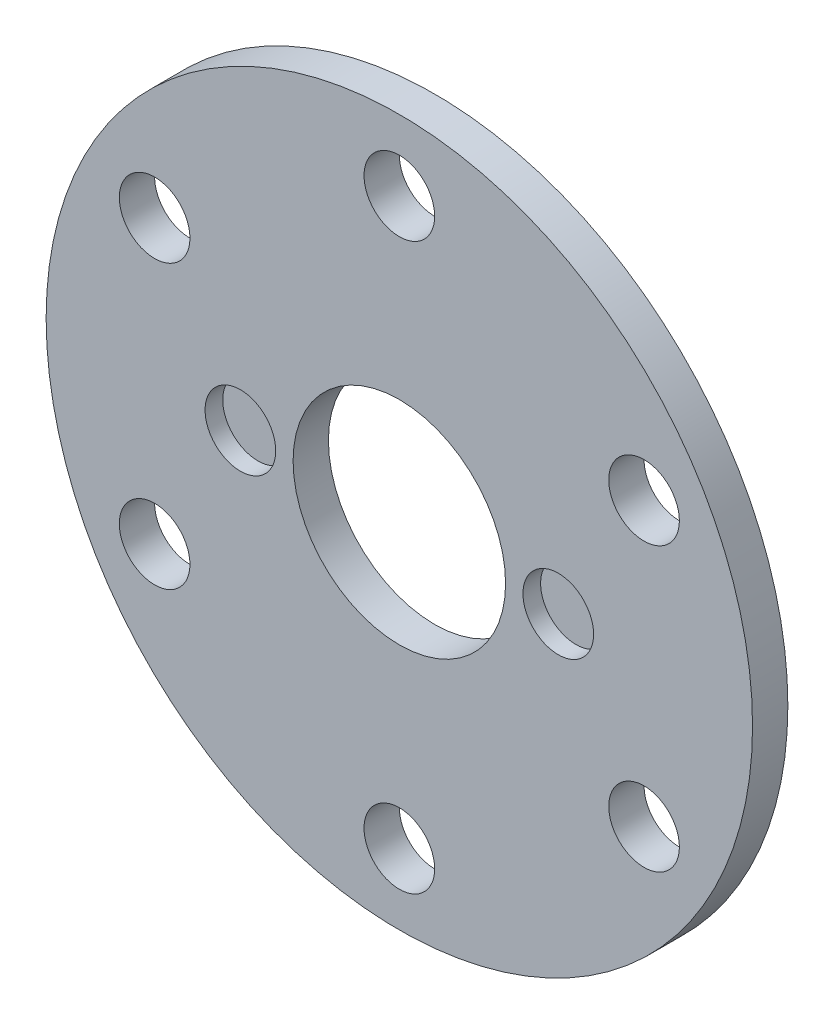
ISO-10303-21;
HEADER;
FILE_DESCRIPTION(('STEP AP214'),'2;1');
FILE_NAME('part.step','',(''),(''),'','','');
FILE_SCHEMA(('AUTOMOTIVE_DESIGN { 1 0 10303 214 1 1 1 1 }'));
ENDSEC;
DATA;
#1=APPLICATION_CONTEXT('core data for automotive mechanical design processes');
#2=APPLICATION_PROTOCOL_DEFINITION('international standard','automotive_design',2000,#1);
#3=PRODUCT_CONTEXT('',#1,'mechanical');
#4=PRODUCT('Part','Part','',(#3));
#5=PRODUCT_RELATED_PRODUCT_CATEGORY('part','',(#4));
#6=PRODUCT_DEFINITION_FORMATION('','',#4);
#7=PRODUCT_DEFINITION_CONTEXT('part definition',#1,'design');
#8=PRODUCT_DEFINITION('design','',#6,#7);
#9=PRODUCT_DEFINITION_SHAPE('','',#8);
#10=(LENGTH_UNIT() NAMED_UNIT(*) SI_UNIT(.MILLI.,.METRE.));
#11=(NAMED_UNIT(*) PLANE_ANGLE_UNIT() SI_UNIT($,.RADIAN.));
#12=(NAMED_UNIT(*) SI_UNIT($,.STERADIAN.) SOLID_ANGLE_UNIT());
#13=UNCERTAINTY_MEASURE_WITH_UNIT(LENGTH_MEASURE(1.E-05),#10,'distance_accuracy_value','');
#14=(GEOMETRIC_REPRESENTATION_CONTEXT(3) GLOBAL_UNCERTAINTY_ASSIGNED_CONTEXT((#13)) GLOBAL_UNIT_ASSIGNED_CONTEXT((#10,
#11,#12)) REPRESENTATION_CONTEXT('',''));
#15=CARTESIAN_POINT('',(0.,0.,0.));
#16=DIRECTION('',(0.,0.,1.));
#17=DIRECTION('',(1.,0.,0.));
#18=AXIS2_PLACEMENT_3D('',#15,#16,#17);
#19=CARTESIAN_POINT('',(0.,762.756140975888,194.376675));
#20=DIRECTION('',(0.,0.,-1.));
#21=DIRECTION('',(-1.,0.,0.));
#22=AXIS2_PLACEMENT_3D('',#19,#20,#21);
#23=CYLINDRICAL_SURFACE('',#22,31.7499999999999);
#24=CARTESIAN_POINT('',(0.,762.756140975888,194.376675));
#25=DIRECTION('',(0.,0.,1.));
#26=DIRECTION('',(1.,0.,0.));
#27=AXIS2_PLACEMENT_3D('',#24,#25,#26);
#28=CIRCLE('',#27,31.7499999999999);
#29=CARTESIAN_POINT('',(31.7499999999999,762.756140975888,194.376675));
#30=VERTEX_POINT('',#29);
#31=EDGE_CURVE('E40',#30,#30,#28,.T.);
#32=ORIENTED_EDGE('',*,*,#31,.F.);
#33=EDGE_LOOP('',(#32));
#34=FACE_BOUND('',#33,.T.);
#35=CARTESIAN_POINT('',(0.,762.756140975888,191.201675));
#36=DIRECTION('',(0.,0.,1.));
#37=DIRECTION('',(1.,0.,0.));
#38=AXIS2_PLACEMENT_3D('',#35,#36,#37);
#39=CIRCLE('',#38,31.7499999999999);
#40=CARTESIAN_POINT('',(31.7499999999999,762.756140975888,191.201675));
#41=VERTEX_POINT('',#40);
#42=EDGE_CURVE('E67',#41,#41,#39,.T.);
#43=ORIENTED_EDGE('',*,*,#42,.T.);
#44=EDGE_LOOP('',(#43));
#45=FACE_BOUND('',#44,.T.);
#46=ADVANCED_FACE('F32',(#34,#45),#23,.T.);
#47=CARTESIAN_POINT('',(0.,788.156140975888,194.376675));
#48=DIRECTION('',(0.,0.,-1.));
#49=DIRECTION('',(-1.,0.,0.));
#50=AXIS2_PLACEMENT_3D('',#47,#48,#49);
#51=CYLINDRICAL_SURFACE('',#50,3.17499999999999);
#52=CARTESIAN_POINT('',(0.,788.156140975888,194.376675));
#53=DIRECTION('',(0.,0.,1.));
#54=DIRECTION('',(1.,0.,0.));
#55=AXIS2_PLACEMENT_3D('',#52,#53,#54);
#56=CIRCLE('',#55,3.17499999999999);
#57=CARTESIAN_POINT('',(3.17499999999999,788.156140975888,194.376675));
#58=VERTEX_POINT('',#57);
#59=EDGE_CURVE('E45',#58,#58,#56,.T.);
#60=ORIENTED_EDGE('',*,*,#59,.T.);
#61=EDGE_LOOP('',(#60));
#62=FACE_BOUND('',#61,.T.);
#63=CARTESIAN_POINT('',(0.,788.156140975888,191.201675));
#64=DIRECTION('',(0.,0.,1.));
#65=DIRECTION('',(1.,0.,0.));
#66=AXIS2_PLACEMENT_3D('',#63,#64,#65);
#67=CIRCLE('',#66,3.17499999999999);
#68=CARTESIAN_POINT('',(3.17499999999999,788.156140975888,191.201675));
#69=VERTEX_POINT('',#68);
#70=EDGE_CURVE('E65',#69,#69,#67,.T.);
#71=ORIENTED_EDGE('',*,*,#70,.F.);
#72=EDGE_LOOP('',(#71));
#73=FACE_BOUND('',#72,.T.);
#74=ADVANCED_FACE('F97',(#62,#73),#51,.F.);
#75=CARTESIAN_POINT('',(21.9970452561247,775.456140975888,194.376675));
#76=DIRECTION('',(0.,0.,-1.));
#77=DIRECTION('',(-1.,0.,0.));
#78=AXIS2_PLACEMENT_3D('',#75,#76,#77);
#79=CYLINDRICAL_SURFACE('',#78,3.17499999999996);
#80=CARTESIAN_POINT('',(21.9970452561247,775.456140975888,194.376675));
#81=DIRECTION('',(0.,0.,1.));
#82=DIRECTION('',(1.,0.,0.));
#83=AXIS2_PLACEMENT_3D('',#80,#81,#82);
#84=CIRCLE('',#83,3.17499999999996);
#85=CARTESIAN_POINT('',(25.1720452561246,775.456140975888,194.376675));
#86=VERTEX_POINT('',#85);
#87=EDGE_CURVE('E92',#86,#86,#84,.T.);
#88=ORIENTED_EDGE('',*,*,#87,.T.);
#89=EDGE_LOOP('',(#88));
#90=FACE_BOUND('',#89,.T.);
#91=CARTESIAN_POINT('',(21.9970452561247,775.456140975888,191.201675));
#92=DIRECTION('',(0.,0.,1.));
#93=DIRECTION('',(1.,0.,0.));
#94=AXIS2_PLACEMENT_3D('',#91,#92,#93);
#95=CIRCLE('',#94,3.17499999999996);
#96=CARTESIAN_POINT('',(25.1720452561246,775.456140975888,191.201675));
#97=VERTEX_POINT('',#96);
#98=EDGE_CURVE('E62',#97,#97,#95,.T.);
#99=ORIENTED_EDGE('',*,*,#98,.F.);
#100=EDGE_LOOP('',(#99));
#101=FACE_BOUND('',#100,.T.);
#102=ADVANCED_FACE('F114',(#90,#101),#79,.F.);
#103=CARTESIAN_POINT('',(21.9970452561247,750.056140975888,194.376675));
#104=DIRECTION('',(0.,0.,-1.));
#105=DIRECTION('',(-1.,0.,0.));
#106=AXIS2_PLACEMENT_3D('',#103,#104,#105);
#107=CYLINDRICAL_SURFACE('',#106,3.17499999999999);
#108=CARTESIAN_POINT('',(21.9970452561247,750.056140975888,194.376675));
#109=DIRECTION('',(0.,0.,1.));
#110=DIRECTION('',(1.,0.,0.));
#111=AXIS2_PLACEMENT_3D('',#108,#109,#110);
#112=CIRCLE('',#111,3.17499999999999);
#113=CARTESIAN_POINT('',(25.1720452561247,750.056140975888,194.376675));
#114=VERTEX_POINT('',#113);
#115=EDGE_CURVE('E89',#114,#114,#112,.T.);
#116=ORIENTED_EDGE('',*,*,#115,.T.);
#117=EDGE_LOOP('',(#116));
#118=FACE_BOUND('',#117,.T.);
#119=CARTESIAN_POINT('',(21.9970452561247,750.056140975888,191.201675));
#120=DIRECTION('',(0.,0.,1.));
#121=DIRECTION('',(1.,0.,0.));
#122=AXIS2_PLACEMENT_3D('',#119,#120,#121);
#123=CIRCLE('',#122,3.17499999999999);
#124=CARTESIAN_POINT('',(25.1720452561247,750.056140975888,191.201675));
#125=VERTEX_POINT('',#124);
#126=EDGE_CURVE('E59',#125,#125,#123,.T.);
#127=ORIENTED_EDGE('',*,*,#126,.F.);
#128=EDGE_LOOP('',(#127));
#129=FACE_BOUND('',#128,.T.);
#130=ADVANCED_FACE('F121',(#118,#129),#107,.F.);
#131=CARTESIAN_POINT('',(0.,737.356140975888,194.376675));
#132=DIRECTION('',(0.,0.,-1.));
#133=DIRECTION('',(-1.,0.,0.));
#134=AXIS2_PLACEMENT_3D('',#131,#132,#133);
#135=CYLINDRICAL_SURFACE('',#134,3.17499999999999);
#136=CARTESIAN_POINT('',(0.,737.356140975888,194.376675));
#137=DIRECTION('',(0.,0.,1.));
#138=DIRECTION('',(1.,0.,0.));
#139=AXIS2_PLACEMENT_3D('',#136,#137,#138);
#140=CIRCLE('',#139,3.17499999999999);
#141=CARTESIAN_POINT('',(3.17500000000005,737.356140975888,194.376675));
#142=VERTEX_POINT('',#141);
#143=EDGE_CURVE('E81',#142,#142,#140,.T.);
#144=ORIENTED_EDGE('',*,*,#143,.T.);
#145=EDGE_LOOP('',(#144));
#146=FACE_BOUND('',#145,.T.);
#147=CARTESIAN_POINT('',(0.,737.356140975888,191.201675));
#148=DIRECTION('',(0.,0.,1.));
#149=DIRECTION('',(1.,0.,0.));
#150=AXIS2_PLACEMENT_3D('',#147,#148,#149);
#151=CIRCLE('',#150,3.17499999999999);
#152=CARTESIAN_POINT('',(3.17500000000005,737.356140975888,191.201675));
#153=VERTEX_POINT('',#152);
#154=EDGE_CURVE('E56',#153,#153,#151,.T.);
#155=ORIENTED_EDGE('',*,*,#154,.F.);
#156=EDGE_LOOP('',(#155));
#157=FACE_BOUND('',#156,.T.);
#158=ADVANCED_FACE('F125',(#146,#157),#135,.F.);
#159=CARTESIAN_POINT('',(-21.9970452561247,750.056140975888,194.376675));
#160=DIRECTION('',(0.,0.,-1.));
#161=DIRECTION('',(-1.,0.,0.));
#162=AXIS2_PLACEMENT_3D('',#159,#160,#161);
#163=CYLINDRICAL_SURFACE('',#162,3.17499999999996);
#164=CARTESIAN_POINT('',(-21.9970452561247,750.056140975888,194.376675));
#165=DIRECTION('',(0.,0.,1.));
#166=DIRECTION('',(1.,0.,0.));
#167=AXIS2_PLACEMENT_3D('',#164,#165,#166);
#168=CIRCLE('',#167,3.17499999999996);
#169=CARTESIAN_POINT('',(-18.8220452561247,750.056140975888,194.376675));
#170=VERTEX_POINT('',#169);
#171=EDGE_CURVE('E76',#170,#170,#168,.T.);
#172=ORIENTED_EDGE('',*,*,#171,.T.);
#173=EDGE_LOOP('',(#172));
#174=FACE_BOUND('',#173,.T.);
#175=CARTESIAN_POINT('',(-21.9970452561247,750.056140975888,191.201675));
#176=DIRECTION('',(0.,0.,1.));
#177=DIRECTION('',(1.,0.,0.));
#178=AXIS2_PLACEMENT_3D('',#175,#176,#177);
#179=CIRCLE('',#178,3.17499999999996);
#180=CARTESIAN_POINT('',(-18.8220452561247,750.056140975888,191.201675));
#181=VERTEX_POINT('',#180);
#182=EDGE_CURVE('E52',#181,#181,#179,.T.);
#183=ORIENTED_EDGE('',*,*,#182,.F.);
#184=EDGE_LOOP('',(#183));
#185=FACE_BOUND('',#184,.T.);
#186=ADVANCED_FACE('F128',(#174,#185),#163,.F.);
#187=CARTESIAN_POINT('',(-21.9970452561247,775.456140975888,194.376675));
#188=DIRECTION('',(0.,0.,-1.));
#189=DIRECTION('',(-1.,0.,0.));
#190=AXIS2_PLACEMENT_3D('',#187,#188,#189);
#191=CYLINDRICAL_SURFACE('',#190,3.17500000000003);
#192=CARTESIAN_POINT('',(-21.9970452561247,775.456140975888,194.376675));
#193=DIRECTION('',(0.,0.,1.));
#194=DIRECTION('',(1.,0.,0.));
#195=AXIS2_PLACEMENT_3D('',#192,#193,#194);
#196=CIRCLE('',#195,3.17500000000003);
#197=CARTESIAN_POINT('',(-18.8220452561246,775.456140975888,194.376675));
#198=VERTEX_POINT('',#197);
#199=EDGE_CURVE('E72',#198,#198,#196,.T.);
#200=ORIENTED_EDGE('',*,*,#199,.T.);
#201=EDGE_LOOP('',(#200));
#202=FACE_BOUND('',#201,.T.);
#203=CARTESIAN_POINT('',(-21.9970452561247,775.456140975888,191.201675));
#204=DIRECTION('',(0.,0.,1.));
#205=DIRECTION('',(1.,0.,0.));
#206=AXIS2_PLACEMENT_3D('',#203,#204,#205);
#207=CIRCLE('',#206,3.17500000000003);
#208=CARTESIAN_POINT('',(-18.8220452561246,775.456140975888,191.201675));
#209=VERTEX_POINT('',#208);
#210=EDGE_CURVE('E49',#209,#209,#207,.T.);
#211=ORIENTED_EDGE('',*,*,#210,.F.);
#212=EDGE_LOOP('',(#211));
#213=FACE_BOUND('',#212,.T.);
#214=ADVANCED_FACE('F34',(#202,#213),#191,.F.);
#215=CARTESIAN_POINT('',(0.,762.756140975888,194.376675));
#216=DIRECTION('',(0.,0.,-1.));
#217=DIRECTION('',(-1.,0.,0.));
#218=AXIS2_PLACEMENT_3D('',#215,#216,#217);
#219=CYLINDRICAL_SURFACE('',#218,9.5504);
#220=CARTESIAN_POINT('',(0.,762.756140975888,194.376675));
#221=DIRECTION('',(0.,0.,1.));
#222=DIRECTION('',(1.,0.,0.));
#223=AXIS2_PLACEMENT_3D('',#220,#221,#222);
#224=CIRCLE('',#223,9.5504);
#225=CARTESIAN_POINT('',(9.55040000000003,762.756140975888,194.376675));
#226=VERTEX_POINT('',#225);
#227=EDGE_CURVE('E10',#226,#226,#224,.F.);
#228=ORIENTED_EDGE('',*,*,#227,.F.);
#229=EDGE_LOOP('',(#228));
#230=FACE_BOUND('',#229,.T.);
#231=CARTESIAN_POINT('',(0.,762.756140975888,191.201675));
#232=DIRECTION('',(0.,0.,1.));
#233=DIRECTION('',(1.,0.,0.));
#234=AXIS2_PLACEMENT_3D('',#231,#232,#233);
#235=CIRCLE('',#234,9.5504);
#236=CARTESIAN_POINT('',(9.55040000000003,762.756140975888,191.201675));
#237=VERTEX_POINT('',#236);
#238=EDGE_CURVE('E36',#237,#237,#235,.F.);
#239=ORIENTED_EDGE('',*,*,#238,.T.);
#240=EDGE_LOOP('',(#239));
#241=FACE_BOUND('',#240,.T.);
#242=ADVANCED_FACE('F104',(#230,#241),#219,.F.);
#243=CARTESIAN_POINT('',(0.,0.,194.376675));
#244=DIRECTION('',(0.,0.,1.));
#245=DIRECTION('',(1.,0.,0.));
#246=AXIS2_PLACEMENT_3D('',#243,#244,#245);
#247=PLANE('',#246);
#248=CARTESIAN_POINT('',(-14.2875,762.756140975888,194.376675));
#249=DIRECTION('',(0.,0.,1.));
#250=DIRECTION('',(1.,0.,0.));
#251=AXIS2_PLACEMENT_3D('',#248,#249,#250);
#252=CIRCLE('',#251,3.17500000000036);
#253=CARTESIAN_POINT('',(-11.1124999999996,762.756140975888,194.376675));
#254=VERTEX_POINT('',#253);
#255=EDGE_CURVE('E176',#254,#254,#252,.T.);
#256=ORIENTED_EDGE('',*,*,#255,.F.);
#257=EDGE_LOOP('',(#256));
#258=FACE_BOUND('',#257,.T.);
#259=CARTESIAN_POINT('',(14.2875,762.756140975888,194.376675));
#260=DIRECTION('',(0.,0.,1.));
#261=DIRECTION('',(1.,0.,0.));
#262=AXIS2_PLACEMENT_3D('',#259,#260,#261);
#263=CIRCLE('',#262,3.17500000000034);
#264=CARTESIAN_POINT('',(17.4625000000004,762.756140975888,194.376675));
#265=VERTEX_POINT('',#264);
#266=EDGE_CURVE('E84',#265,#265,#263,.T.);
#267=ORIENTED_EDGE('',*,*,#266,.F.);
#268=EDGE_LOOP('',(#267));
#269=FACE_BOUND('',#268,.T.);
#270=ORIENTED_EDGE('',*,*,#199,.F.);
#271=EDGE_LOOP('',(#270));
#272=FACE_BOUND('',#271,.T.);
#273=ORIENTED_EDGE('',*,*,#171,.F.);
#274=EDGE_LOOP('',(#273));
#275=FACE_BOUND('',#274,.T.);
#276=ORIENTED_EDGE('',*,*,#143,.F.);
#277=EDGE_LOOP('',(#276));
#278=FACE_BOUND('',#277,.T.);
#279=ORIENTED_EDGE('',*,*,#115,.F.);
#280=EDGE_LOOP('',(#279));
#281=FACE_BOUND('',#280,.T.);
#282=ORIENTED_EDGE('',*,*,#87,.F.);
#283=EDGE_LOOP('',(#282));
#284=FACE_BOUND('',#283,.T.);
#285=ORIENTED_EDGE('',*,*,#59,.F.);
#286=EDGE_LOOP('',(#285));
#287=FACE_BOUND('',#286,.T.);
#288=ORIENTED_EDGE('',*,*,#31,.T.);
#289=EDGE_LOOP('',(#288));
#290=FACE_BOUND('',#289,.T.);
#291=ORIENTED_EDGE('',*,*,#227,.T.);
#292=EDGE_LOOP('',(#291));
#293=FACE_BOUND('',#292,.T.);
#294=ADVANCED_FACE('F100',(#258,#269,#272,#275,#278,#281,#284,#287,#290,#293),#247,.T.);
#295=CARTESIAN_POINT('',(0.,0.,191.201675));
#296=DIRECTION('',(0.,0.,1.));
#297=DIRECTION('',(1.,0.,0.));
#298=AXIS2_PLACEMENT_3D('',#295,#296,#297);
#299=PLANE('',#298);
#300=ORIENTED_EDGE('',*,*,#210,.T.);
#301=EDGE_LOOP('',(#300));
#302=FACE_BOUND('',#301,.T.);
#303=ORIENTED_EDGE('',*,*,#182,.T.);
#304=EDGE_LOOP('',(#303));
#305=FACE_BOUND('',#304,.T.);
#306=ORIENTED_EDGE('',*,*,#154,.T.);
#307=EDGE_LOOP('',(#306));
#308=FACE_BOUND('',#307,.T.);
#309=ORIENTED_EDGE('',*,*,#126,.T.);
#310=EDGE_LOOP('',(#309));
#311=FACE_BOUND('',#310,.T.);
#312=ORIENTED_EDGE('',*,*,#98,.T.);
#313=EDGE_LOOP('',(#312));
#314=FACE_BOUND('',#313,.T.);
#315=ORIENTED_EDGE('',*,*,#70,.T.);
#316=EDGE_LOOP('',(#315));
#317=FACE_BOUND('',#316,.T.);
#318=ORIENTED_EDGE('',*,*,#42,.F.);
#319=EDGE_LOOP('',(#318));
#320=FACE_BOUND('',#319,.T.);
#321=ORIENTED_EDGE('',*,*,#238,.F.);
#322=EDGE_LOOP('',(#321));
#323=FACE_BOUND('',#322,.T.);
#324=ADVANCED_FACE('F103',(#302,#305,#308,#311,#314,#317,#320,#323),#299,.F.);
#325=CARTESIAN_POINT('',(14.2875,762.756140975888,192.789175));
#326=DIRECTION('',(0.,0.,1.));
#327=DIRECTION('',(1.,0.,0.));
#328=AXIS2_PLACEMENT_3D('',#325,#326,#327);
#329=CYLINDRICAL_SURFACE('',#328,3.17500000000034);
#330=CARTESIAN_POINT('',(14.2875,762.756140975888,192.789175));
#331=DIRECTION('',(0.,0.,1.));
#332=DIRECTION('',(1.,0.,0.));
#333=AXIS2_PLACEMENT_3D('',#330,#331,#332);
#334=CIRCLE('',#333,3.17500000000034);
#335=CARTESIAN_POINT('',(17.4625000000004,762.756140975888,192.789175));
#336=VERTEX_POINT('',#335);
#337=EDGE_CURVE('E179',#336,#336,#334,.T.);
#338=ORIENTED_EDGE('',*,*,#337,.F.);
#339=EDGE_LOOP('',(#338));
#340=FACE_BOUND('',#339,.T.);
#341=ORIENTED_EDGE('',*,*,#266,.T.);
#342=EDGE_LOOP('',(#341));
#343=FACE_BOUND('',#342,.T.);
#344=ADVANCED_FACE('F141',(#340,#343),#329,.F.);
#345=CARTESIAN_POINT('',(14.2875,762.756140975888,192.789175));
#346=DIRECTION('',(0.,0.,1.));
#347=DIRECTION('',(1.,0.,0.));
#348=AXIS2_PLACEMENT_3D('',#345,#346,#347);
#349=PLANE('',#348);
#350=ORIENTED_EDGE('',*,*,#337,.T.);
#351=EDGE_LOOP('',(#350));
#352=FACE_BOUND('',#351,.T.);
#353=ADVANCED_FACE('F158',(#352),#349,.T.);
#354=CARTESIAN_POINT('',(-14.2875,762.756140975888,192.789175));
#355=DIRECTION('',(0.,0.,1.));
#356=DIRECTION('',(1.,0.,0.));
#357=AXIS2_PLACEMENT_3D('',#354,#355,#356);
#358=CYLINDRICAL_SURFACE('',#357,3.17500000000036);
#359=CARTESIAN_POINT('',(-14.2875,762.756140975888,192.789175));
#360=DIRECTION('',(0.,0.,1.));
#361=DIRECTION('',(1.,0.,0.));
#362=AXIS2_PLACEMENT_3D('',#359,#360,#361);
#363=CIRCLE('',#362,3.17500000000036);
#364=CARTESIAN_POINT('',(-11.1124999999996,762.756140975888,192.789175));
#365=VERTEX_POINT('',#364);
#366=EDGE_CURVE('E53',#365,#365,#363,.T.);
#367=ORIENTED_EDGE('',*,*,#366,.F.);
#368=EDGE_LOOP('',(#367));
#369=FACE_BOUND('',#368,.T.);
#370=ORIENTED_EDGE('',*,*,#255,.T.);
#371=EDGE_LOOP('',(#370));
#372=FACE_BOUND('',#371,.T.);
#373=ADVANCED_FACE('F164',(#369,#372),#358,.F.);
#374=CARTESIAN_POINT('',(-14.2875,762.756140975888,192.789175));
#375=DIRECTION('',(0.,0.,1.));
#376=DIRECTION('',(1.,0.,0.));
#377=AXIS2_PLACEMENT_3D('',#374,#375,#376);
#378=PLANE('',#377);
#379=ORIENTED_EDGE('',*,*,#366,.T.);
#380=EDGE_LOOP('',(#379));
#381=FACE_BOUND('',#380,.T.);
#382=ADVANCED_FACE('F168',(#381),#378,.T.);
#383=CLOSED_SHELL('',(#46,#74,#102,#130,#158,#186,#214,#242,#294,#324,#344,#353,#373,#382));
#384=MANIFOLD_SOLID_BREP('B2',#383);
#385=ADVANCED_BREP_SHAPE_REPRESENTATION('',(#18,#384),#14);
#386=SHAPE_DEFINITION_REPRESENTATION(#9,#385);
ENDSEC;
END-ISO-10303-21;
